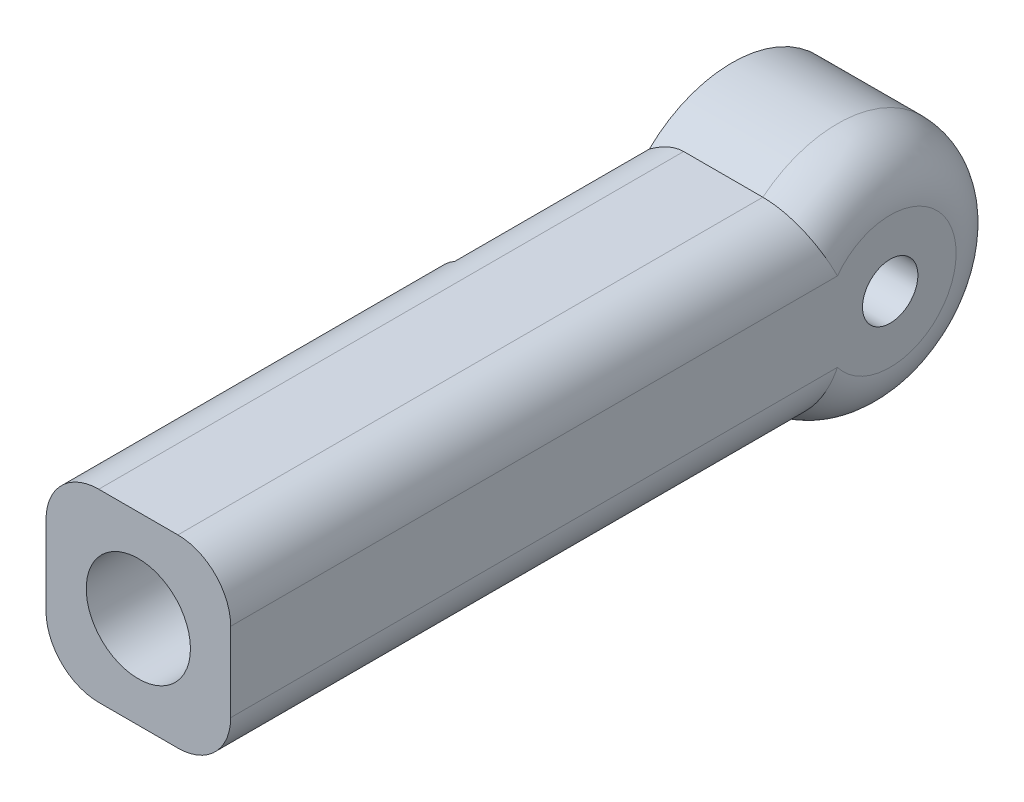
ISO-10303-21;
HEADER;
FILE_DESCRIPTION(('STEP AP214'),'2;1');
FILE_NAME('part.step','',(''),(''),'','','');
FILE_SCHEMA(('AUTOMOTIVE_DESIGN { 1 0 10303 214 1 1 1 1 }'));
ENDSEC;
DATA;
#1=APPLICATION_CONTEXT('core data for automotive mechanical design processes');
#2=APPLICATION_PROTOCOL_DEFINITION('international standard','automotive_design',2000,#1);
#3=PRODUCT_CONTEXT('',#1,'mechanical');
#4=PRODUCT('Part','Part','',(#3));
#5=PRODUCT_RELATED_PRODUCT_CATEGORY('part','',(#4));
#6=PRODUCT_DEFINITION_FORMATION('','',#4);
#7=PRODUCT_DEFINITION_CONTEXT('part definition',#1,'design');
#8=PRODUCT_DEFINITION('design','',#6,#7);
#9=PRODUCT_DEFINITION_SHAPE('','',#8);
#10=(LENGTH_UNIT() NAMED_UNIT(*) SI_UNIT(.MILLI.,.METRE.));
#11=(NAMED_UNIT(*) PLANE_ANGLE_UNIT() SI_UNIT($,.RADIAN.));
#12=(NAMED_UNIT(*) SI_UNIT($,.STERADIAN.) SOLID_ANGLE_UNIT());
#13=UNCERTAINTY_MEASURE_WITH_UNIT(LENGTH_MEASURE(1.E-05),#10,'distance_accuracy_value','');
#14=(GEOMETRIC_REPRESENTATION_CONTEXT(3) GLOBAL_UNCERTAINTY_ASSIGNED_CONTEXT((#13)) GLOBAL_UNIT_ASSIGNED_CONTEXT((#10,
#11,#12)) REPRESENTATION_CONTEXT('',''));
#15=CARTESIAN_POINT('',(0.,0.,0.));
#16=DIRECTION('',(0.,0.,1.));
#17=DIRECTION('',(1.,0.,0.));
#18=AXIS2_PLACEMENT_3D('',#15,#16,#17);
#19=CARTESIAN_POINT('',(7.,14.,0.));
#20=DIRECTION('',(0.,0.,-1.));
#21=DIRECTION('',(-1.,0.,0.));
#22=AXIS2_PLACEMENT_3D('',#19,#20,#21);
#23=PLANE('',#22);
#24=CARTESIAN_POINT('',(0.,7.,0.));
#25=DIRECTION('',(0.,0.,1.));
#26=DIRECTION('',(1.,0.,0.));
#27=AXIS2_PLACEMENT_3D('',#24,#25,#26);
#28=CIRCLE('',#27,3.95);
#29=CARTESIAN_POINT('',(3.95,7.,0.));
#30=VERTEX_POINT('',#29);
#31=EDGE_CURVE('E262',#30,#30,#28,.T.);
#32=ORIENTED_EDGE('',*,*,#31,.F.);
#33=EDGE_LOOP('',(#32));
#34=FACE_BOUND('',#33,.T.);
#35=DIRECTION('',(0.,-1.,0.));
#36=VECTOR('',#35,1.);
#37=CARTESIAN_POINT('',(-7.,14.,0.));
#38=LINE('',#37,#36);
#39=CARTESIAN_POINT('',(-7.,10.,0.));
#40=VERTEX_POINT('',#39);
#41=CARTESIAN_POINT('',(-7.,4.,0.));
#42=VERTEX_POINT('',#41);
#43=EDGE_CURVE('E279',#40,#42,#38,.T.);
#44=ORIENTED_EDGE('',*,*,#43,.T.);
#45=CARTESIAN_POINT('',(-3.,4.,0.));
#46=DIRECTION('',(0.,0.,-1.));
#47=DIRECTION('',(-1.,0.,0.));
#48=AXIS2_PLACEMENT_3D('',#45,#46,#47);
#49=CIRCLE('',#48,4.);
#50=CARTESIAN_POINT('',(-3.,0.,0.));
#51=VERTEX_POINT('',#50);
#52=EDGE_CURVE('E321',#42,#51,#49,.F.);
#53=ORIENTED_EDGE('',*,*,#52,.T.);
#54=DIRECTION('',(-1.,0.,0.));
#55=VECTOR('',#54,1.);
#56=CARTESIAN_POINT('',(7.,0.,0.));
#57=LINE('',#56,#55);
#58=CARTESIAN_POINT('',(3.,0.,0.));
#59=VERTEX_POINT('',#58);
#60=EDGE_CURVE('E153',#59,#51,#57,.T.);
#61=ORIENTED_EDGE('',*,*,#60,.F.);
#62=CARTESIAN_POINT('',(3.,4.,0.));
#63=DIRECTION('',(0.,0.,-1.));
#64=DIRECTION('',(-1.,0.,0.));
#65=AXIS2_PLACEMENT_3D('',#62,#63,#64);
#66=CIRCLE('',#65,4.);
#67=CARTESIAN_POINT('',(7.,4.,0.));
#68=VERTEX_POINT('',#67);
#69=EDGE_CURVE('E159',#59,#68,#66,.F.);
#70=ORIENTED_EDGE('',*,*,#69,.T.);
#71=DIRECTION('',(0.,-1.,0.));
#72=VECTOR('',#71,1.);
#73=CARTESIAN_POINT('',(7.,14.,0.));
#74=LINE('',#73,#72);
#75=CARTESIAN_POINT('',(7.,10.,0.));
#76=VERTEX_POINT('',#75);
#77=EDGE_CURVE('E280',#76,#68,#74,.T.);
#78=ORIENTED_EDGE('',*,*,#77,.F.);
#79=CARTESIAN_POINT('',(3.,10.,0.));
#80=DIRECTION('',(0.,0.,-1.));
#81=DIRECTION('',(-1.,0.,0.));
#82=AXIS2_PLACEMENT_3D('',#79,#80,#81);
#83=CIRCLE('',#82,4.);
#84=CARTESIAN_POINT('',(3.,14.,0.));
#85=VERTEX_POINT('',#84);
#86=EDGE_CURVE('E317',#76,#85,#83,.F.);
#87=ORIENTED_EDGE('',*,*,#86,.T.);
#88=DIRECTION('',(-1.,0.,0.));
#89=VECTOR('',#88,1.);
#90=CARTESIAN_POINT('',(7.,14.,0.));
#91=LINE('',#90,#89);
#92=CARTESIAN_POINT('',(-3.,14.,0.));
#93=VERTEX_POINT('',#92);
#94=EDGE_CURVE('E282',#85,#93,#91,.T.);
#95=ORIENTED_EDGE('',*,*,#94,.T.);
#96=CARTESIAN_POINT('',(-3.,10.,0.));
#97=DIRECTION('',(0.,0.,-1.));
#98=DIRECTION('',(-1.,0.,0.));
#99=AXIS2_PLACEMENT_3D('',#96,#97,#98);
#100=CIRCLE('',#99,4.);
#101=EDGE_CURVE('E315',#93,#40,#100,.F.);
#102=ORIENTED_EDGE('',*,*,#101,.T.);
#103=EDGE_LOOP('',(#44,#53,#61,#70,#78,#87,#95,#102));
#104=FACE_BOUND('',#103,.T.);
#105=ADVANCED_FACE('F43',(#34,#104),#23,.F.);
#106=CARTESIAN_POINT('',(7.,0.,0.));
#107=DIRECTION('',(0.,1.,0.));
#108=DIRECTION('',(0.,0.,1.));
#109=AXIS2_PLACEMENT_3D('',#106,#107,#108);
#110=PLANE('',#109);
#111=ORIENTED_EDGE('',*,*,#60,.T.);
#112=DIRECTION('',(0.,0.,-1.));
#113=VECTOR('',#112,1.);
#114=CARTESIAN_POINT('',(-3.,0.,-29.));
#115=LINE('',#114,#113);
#116=CARTESIAN_POINT('',(-3.,0.,-44.3431457505076));
#117=VERTEX_POINT('',#116);
#118=EDGE_CURVE('E152',#51,#117,#115,.T.);
#119=ORIENTED_EDGE('',*,*,#118,.T.);
#120=DIRECTION('',(-1.,0.,0.));
#121=VECTOR('',#120,1.);
#122=CARTESIAN_POINT('',(7.,0.,-44.3431457505076));
#123=LINE('',#122,#121);
#124=CARTESIAN_POINT('',(3.,0.,-44.3431457505076));
#125=VERTEX_POINT('',#124);
#126=EDGE_CURVE('E136',#125,#117,#123,.T.);
#127=ORIENTED_EDGE('',*,*,#126,.F.);
#128=DIRECTION('',(0.,0.,-1.));
#129=VECTOR('',#128,1.);
#130=CARTESIAN_POINT('',(3.,0.,0.));
#131=LINE('',#130,#129);
#132=EDGE_CURVE('E149',#125,#59,#131,.F.);
#133=ORIENTED_EDGE('',*,*,#132,.T.);
#134=EDGE_LOOP('',(#111,#119,#127,#133));
#135=FACE_BOUND('',#134,.T.);
#136=ADVANCED_FACE('F148',(#135),#110,.F.);
#137=CARTESIAN_POINT('',(7.,7.,-50.));
#138=DIRECTION('',(-1.,0.,0.));
#139=DIRECTION('',(0.,0.,1.));
#140=AXIS2_PLACEMENT_3D('',#137,#138,#139);
#141=CYLINDRICAL_SURFACE('',#140,9.00000000000002);
#142=DIRECTION('',(-1.,0.,0.));
#143=VECTOR('',#142,1.);
#144=CARTESIAN_POINT('',(7.,14.,-44.3431457505076));
#145=LINE('',#144,#143);
#146=CARTESIAN_POINT('',(3.,14.,-44.3431457505076));
#147=VERTEX_POINT('',#146);
#148=CARTESIAN_POINT('',(-3.,14.,-44.3431457505076));
#149=VERTEX_POINT('',#148);
#150=EDGE_CURVE('E138',#147,#149,#145,.T.);
#151=ORIENTED_EDGE('',*,*,#150,.F.);
#152=CARTESIAN_POINT('',(3.,7.,-50.));
#153=DIRECTION('',(-1.,0.,0.));
#154=DIRECTION('',(0.,0.,1.));
#155=AXIS2_PLACEMENT_3D('',#152,#153,#154);
#156=CIRCLE('',#155,9.00000000000002);
#157=EDGE_CURVE('E132',#147,#125,#156,.T.);
#158=ORIENTED_EDGE('',*,*,#157,.T.);
#159=ORIENTED_EDGE('',*,*,#126,.T.);
#160=CARTESIAN_POINT('',(-3.,0.,-44.3431457505076));
#161=CARTESIAN_POINT('',(-3.0901284291927,-3.10900983044397E-05,-44.3432081670165));
#162=CARTESIAN_POINT('',(-3.18021464623232,0.00304460141172136,-44.3393783953009));
#163=CARTESIAN_POINT('',(-3.35921091252534,0.0151623450559649,-44.3244201799329));
#164=CARTESIAN_POINT('',(-3.44812284641537,0.0241932277351229,-44.3133054001532));
#165=CARTESIAN_POINT('',(-3.62153879516282,0.0476399630353421,-44.2846697388711));
#166=CARTESIAN_POINT('',(-3.70609638029895,0.0618965199128939,-44.2673386560431));
#167=CARTESIAN_POINT('',(-3.87281833272948,0.0954618122043751,-44.2269552935628));
#168=CARTESIAN_POINT('',(-3.95498191695584,0.114772180532696,-44.2039011648869));
#169=CARTESIAN_POINT('',(-4.12191132008441,0.15952095567433,-44.1511438922696));
#170=CARTESIAN_POINT('',(-4.2064806665022,0.185284091748121,-44.1210979150121));
#171=CARTESIAN_POINT('',(-4.3721516785743,0.241694369062263,-44.0563352607812));
#172=CARTESIAN_POINT('',(-4.45325181838612,0.272343631890024,-44.0216165559045));
#173=CARTESIAN_POINT('',(-4.61437301449219,0.339173044990269,-43.9472356883128));
#174=CARTESIAN_POINT('',(-4.69427619551781,0.375498968329301,-43.9074507576797));
#175=CARTESIAN_POINT('',(-4.85009321690804,0.452510684425348,-43.8247592931414));
#176=CARTESIAN_POINT('',(-4.92601311787173,0.493189549483541,-43.7818577532586));
#177=CARTESIAN_POINT('',(-5.00000000000007,0.535898384862283,-43.7377807201301));
#178=B_SPLINE_CURVE_WITH_KNOTS('',3,(#160,#161,#162,#163,#164,#165,#166,#167,#168,#169,#170,
#171,#172,#173,#174,#175,#176,#177),.UNSPECIFIED.,.F.,.F.,(4,2,2,2,2,2,2,2,4),(0.,
0.270184743472431,0.539864168918652,0.8019268370722,1.06407428388199,1.3438475101966,
1.62374254836745,1.91260752585141,2.20101942669657),.UNSPECIFIED.);
#179=CARTESIAN_POINT('',(-5.,0.535898384862242,-43.7377807201299));
#180=VERTEX_POINT('',#179);
#181=EDGE_CURVE('E166',#117,#180,#178,.T.);
#182=ORIENTED_EDGE('',*,*,#181,.T.);
#183=CARTESIAN_POINT('',(-5.,7.,-50.));
#184=DIRECTION('',(1.,0.,0.));
#185=DIRECTION('',(0.,0.,-1.));
#186=AXIS2_PLACEMENT_3D('',#183,#184,#185);
#187=CIRCLE('',#186,9.00000000000002);
#188=CARTESIAN_POINT('',(-5.,13.4641016151378,-43.7377807201299));
#189=VERTEX_POINT('',#188);
#190=EDGE_CURVE('E277',#180,#189,#187,.T.);
#191=ORIENTED_EDGE('',*,*,#190,.T.);
#192=CARTESIAN_POINT('',(-5.,13.4641016151378,-43.7377807201299));
#193=CARTESIAN_POINT('',(-4.93136378289156,13.5037184926368,-43.7786710702639));
#194=CARTESIAN_POINT('',(-4.861108362858,13.5415703322536,-43.8185244025753));
#195=CARTESIAN_POINT('',(-4.71717522574085,13.6135597599549,-43.8956076082422));
#196=CARTESIAN_POINT('',(-4.64349252655541,13.6476916834722,-43.9328334509899));
#197=CARTESIAN_POINT('',(-4.41577847957703,13.7447261234888,-44.0403006139496));
#198=CARTESIAN_POINT('',(-4.25650449966885,13.8014325477732,-44.1054551293744));
#199=CARTESIAN_POINT('',(-3.94986848943148,13.8883392177844,-44.2073622252666));
#200=CARTESIAN_POINT('',(-3.80422168073524,13.9212173613601,-44.2468884090995));
#201=CARTESIAN_POINT('',(-3.58132136361631,13.9582477174521,-44.2918349801754));
#202=CARTESIAN_POINT('',(-3.50647298031619,13.9685329933297,-44.3044132077532));
#203=CARTESIAN_POINT('',(-3.35565799594275,13.984876979659,-44.3244676686124));
#204=CARTESIAN_POINT('',(-3.27969216820086,13.990938484522,-44.3319472750272));
#205=CARTESIAN_POINT('',(-3.16964195508287,13.9965450216348,-44.3388726154486));
#206=CARTESIAN_POINT('',(-3.13576302595186,13.9978393422736,-44.3404729149912));
#207=CARTESIAN_POINT('',(-3.06792443331737,13.9995672010202,-44.3426100973169));
#208=CARTESIAN_POINT('',(-3.0339647284307,14.0000000959922,-44.3431461855647));
#209=CARTESIAN_POINT('',(-3.,14.,-44.3431457505076));
#210=B_SPLINE_CURVE_WITH_KNOTS('',3,(#192,#193,#194,#195,#196,#197,#198,#199,#200,#201,#202,
#203,#204,#205,#206,#207,#208,#209),.UNSPECIFIED.,.F.,.F.,(4,2,2,2,2,2,2,2,4),(0.,
0.267447769348498,0.53529727091456,1.07655795339851,1.53787430176634,1.76740267841787,
1.99677905648468,2.09858035880348,2.20045763696002),.UNSPECIFIED.);
#211=EDGE_CURVE('E163',#189,#149,#210,.T.);
#212=ORIENTED_EDGE('',*,*,#211,.T.);
#213=EDGE_LOOP('',(#151,#158,#159,#182,#191,#212));
#214=FACE_BOUND('',#213,.T.);
#215=ADVANCED_FACE('F134',(#214),#141,.T.);
#216=CARTESIAN_POINT('',(7.,14.,0.));
#217=DIRECTION('',(0.,-1.,0.));
#218=DIRECTION('',(0.,0.,-1.));
#219=AXIS2_PLACEMENT_3D('',#216,#217,#218);
#220=PLANE('',#219);
#221=ORIENTED_EDGE('',*,*,#94,.F.);
#222=DIRECTION('',(0.,0.,1.));
#223=VECTOR('',#222,1.);
#224=CARTESIAN_POINT('',(3.,14.,0.));
#225=LINE('',#224,#223);
#226=EDGE_CURVE('E218',#85,#147,#225,.F.);
#227=ORIENTED_EDGE('',*,*,#226,.T.);
#228=ORIENTED_EDGE('',*,*,#150,.T.);
#229=DIRECTION('',(0.,0.,1.));
#230=VECTOR('',#229,1.);
#231=CARTESIAN_POINT('',(-3.,14.,0.));
#232=LINE('',#231,#230);
#233=EDGE_CURVE('E327',#149,#93,#232,.T.);
#234=ORIENTED_EDGE('',*,*,#233,.T.);
#235=EDGE_LOOP('',(#221,#227,#228,#234));
#236=FACE_BOUND('',#235,.T.);
#237=ADVANCED_FACE('F223',(#236),#220,.F.);
#238=CARTESIAN_POINT('',(7.,7.,-50.));
#239=DIRECTION('',(-1.,0.,0.));
#240=DIRECTION('',(0.,0.,1.));
#241=AXIS2_PLACEMENT_3D('',#238,#239,#240);
#242=PLANE('',#241);
#243=CARTESIAN_POINT('',(7.,7.,-50.));
#244=DIRECTION('',(1.,0.,0.));
#245=DIRECTION('',(0.,0.,-1.));
#246=AXIS2_PLACEMENT_3D('',#243,#244,#245);
#247=CIRCLE('',#246,2.1);
#248=CARTESIAN_POINT('',(7.,7.,-52.1));
#249=VERTEX_POINT('',#248);
#250=EDGE_CURVE('E258',#249,#249,#247,.T.);
#251=ORIENTED_EDGE('',*,*,#250,.F.);
#252=EDGE_LOOP('',(#251));
#253=FACE_BOUND('',#252,.T.);
#254=CARTESIAN_POINT('',(7.,7.,-50.));
#255=DIRECTION('',(-1.,0.,0.));
#256=DIRECTION('',(0.,0.,1.));
#257=AXIS2_PLACEMENT_3D('',#254,#255,#256);
#258=CIRCLE('',#257,5.00000000000002);
#259=CARTESIAN_POINT('',(7.,4.,-46.));
#260=VERTEX_POINT('',#259);
#261=CARTESIAN_POINT('',(7.,10.,-46.));
#262=VERTEX_POINT('',#261);
#263=EDGE_CURVE('E142',#260,#262,#258,.F.);
#264=ORIENTED_EDGE('',*,*,#263,.T.);
#265=DIRECTION('',(0.,0.,1.));
#266=VECTOR('',#265,1.);
#267=CARTESIAN_POINT('',(7.,10.,-50.));
#268=LINE('',#267,#266);
#269=EDGE_CURVE('E60',#262,#76,#268,.T.);
#270=ORIENTED_EDGE('',*,*,#269,.T.);
#271=ORIENTED_EDGE('',*,*,#77,.T.);
#272=DIRECTION('',(0.,0.,-1.));
#273=VECTOR('',#272,1.);
#274=CARTESIAN_POINT('',(7.,4.,-50.));
#275=LINE('',#274,#273);
#276=EDGE_CURVE('E68',#68,#260,#275,.T.);
#277=ORIENTED_EDGE('',*,*,#276,.T.);
#278=EDGE_LOOP('',(#264,#270,#271,#277));
#279=FACE_BOUND('',#278,.T.);
#280=ADVANCED_FACE('F227',(#253,#279),#242,.F.);
#281=CARTESIAN_POINT('',(-7.,7.,-50.));
#282=DIRECTION('',(-1.,0.,0.));
#283=DIRECTION('',(0.,0.,1.));
#284=AXIS2_PLACEMENT_3D('',#281,#282,#283);
#285=PLANE('',#284);
#286=DIRECTION('',(0.,1.,0.));
#287=VECTOR('',#286,1.);
#288=CARTESIAN_POINT('',(-7.,7.,-29.));
#289=LINE('',#288,#287);
#290=CARTESIAN_POINT('',(-7.,4.,-29.));
#291=VERTEX_POINT('',#290);
#292=CARTESIAN_POINT('',(-7.,10.,-29.));
#293=VERTEX_POINT('',#292);
#294=EDGE_CURVE('E161',#291,#293,#289,.T.);
#295=ORIENTED_EDGE('',*,*,#294,.F.);
#296=DIRECTION('',(0.,0.,-1.));
#297=VECTOR('',#296,1.);
#298=CARTESIAN_POINT('',(-7.,4.,0.));
#299=LINE('',#298,#297);
#300=EDGE_CURVE('E312',#291,#42,#299,.F.);
#301=ORIENTED_EDGE('',*,*,#300,.T.);
#302=ORIENTED_EDGE('',*,*,#43,.F.);
#303=DIRECTION('',(0.,0.,1.));
#304=VECTOR('',#303,1.);
#305=CARTESIAN_POINT('',(-7.,10.,-29.));
#306=LINE('',#305,#304);
#307=EDGE_CURVE('E310',#40,#293,#306,.F.);
#308=ORIENTED_EDGE('',*,*,#307,.T.);
#309=EDGE_LOOP('',(#295,#301,#302,#308));
#310=FACE_BOUND('',#309,.T.);
#311=ADVANCED_FACE('F229',(#310),#285,.T.);
#312=CARTESIAN_POINT('',(-5.,0.,0.));
#313=DIRECTION('',(1.,0.,0.));
#314=DIRECTION('',(0.,0.,-1.));
#315=AXIS2_PLACEMENT_3D('',#312,#313,#314);
#316=PLANE('',#315);
#317=CARTESIAN_POINT('',(-5.,7.,-50.));
#318=DIRECTION('',(1.,0.,0.));
#319=DIRECTION('',(0.,0.,-1.));
#320=AXIS2_PLACEMENT_3D('',#317,#318,#319);
#321=CIRCLE('',#320,2.1);
#322=CARTESIAN_POINT('',(-5.,7.,-52.1));
#323=VERTEX_POINT('',#322);
#324=EDGE_CURVE('E48',#323,#323,#321,.T.);
#325=ORIENTED_EDGE('',*,*,#324,.T.);
#326=EDGE_LOOP('',(#325));
#327=FACE_BOUND('',#326,.T.);
#328=ORIENTED_EDGE('',*,*,#190,.F.);
#329=DIRECTION('',(0.,0.,1.));
#330=VECTOR('',#329,1.);
#331=CARTESIAN_POINT('',(-5.,0.535898384862242,-43.7377807201299));
#332=LINE('',#331,#330);
#333=CARTESIAN_POINT('',(-5.,0.535898384862244,-29.));
#334=VERTEX_POINT('',#333);
#335=EDGE_CURVE('E301',#180,#334,#332,.T.);
#336=ORIENTED_EDGE('',*,*,#335,.T.);
#337=DIRECTION('',(0.,1.,0.));
#338=VECTOR('',#337,1.);
#339=CARTESIAN_POINT('',(-5.,16.,-29.));
#340=LINE('',#339,#338);
#341=CARTESIAN_POINT('',(-5.,13.4641016151378,-29.));
#342=VERTEX_POINT('',#341);
#343=EDGE_CURVE('E272',#334,#342,#340,.T.);
#344=ORIENTED_EDGE('',*,*,#343,.T.);
#345=DIRECTION('',(0.,0.,-1.));
#346=VECTOR('',#345,1.);
#347=CARTESIAN_POINT('',(-5.,13.4641016151378,-29.));
#348=LINE('',#347,#346);
#349=EDGE_CURVE('E297',#342,#189,#348,.T.);
#350=ORIENTED_EDGE('',*,*,#349,.T.);
#351=EDGE_LOOP('',(#328,#336,#344,#350));
#352=FACE_BOUND('',#351,.T.);
#353=ADVANCED_FACE('F232',(#327,#352),#316,.F.);
#354=CARTESIAN_POINT('',(-5.,16.,-29.));
#355=DIRECTION('',(0.,0.,1.));
#356=DIRECTION('',(0.,-1.,0.));
#357=AXIS2_PLACEMENT_3D('',#354,#355,#356);
#358=PLANE('',#357);
#359=ORIENTED_EDGE('',*,*,#343,.F.);
#360=CARTESIAN_POINT('',(-3.,4.,-29.));
#361=DIRECTION('',(0.,0.,1.));
#362=DIRECTION('',(0.,-1.,0.));
#363=AXIS2_PLACEMENT_3D('',#360,#361,#362);
#364=CIRCLE('',#363,4.);
#365=EDGE_CURVE('E307',#334,#291,#364,.F.);
#366=ORIENTED_EDGE('',*,*,#365,.T.);
#367=ORIENTED_EDGE('',*,*,#294,.T.);
#368=CARTESIAN_POINT('',(-3.,10.,-29.));
#369=DIRECTION('',(0.,0.,1.));
#370=DIRECTION('',(0.,-1.,0.));
#371=AXIS2_PLACEMENT_3D('',#368,#369,#370);
#372=CIRCLE('',#371,4.);
#373=EDGE_CURVE('E304',#293,#342,#372,.F.);
#374=ORIENTED_EDGE('',*,*,#373,.T.);
#375=EDGE_LOOP('',(#359,#366,#367,#374));
#376=FACE_BOUND('',#375,.T.);
#377=ADVANCED_FACE('F211',(#376),#358,.F.);
#378=CARTESIAN_POINT('',(-3.,4.,0.));
#379=DIRECTION('',(0.,0.,1.));
#380=DIRECTION('',(1.,0.,0.));
#381=AXIS2_PLACEMENT_3D('',#378,#379,#380);
#382=CYLINDRICAL_SURFACE('',#381,4.);
#383=ORIENTED_EDGE('',*,*,#52,.F.);
#384=ORIENTED_EDGE('',*,*,#300,.F.);
#385=ORIENTED_EDGE('',*,*,#365,.F.);
#386=ORIENTED_EDGE('',*,*,#335,.F.);
#387=ORIENTED_EDGE('',*,*,#181,.F.);
#388=ORIENTED_EDGE('',*,*,#118,.F.);
#389=EDGE_LOOP('',(#383,#384,#385,#386,#387,#388));
#390=FACE_BOUND('',#389,.T.);
#391=ADVANCED_FACE('F208',(#390),#382,.T.);
#392=CARTESIAN_POINT('',(3.,4.,-50.));
#393=DIRECTION('',(0.,0.,-1.));
#394=DIRECTION('',(-1.,0.,0.));
#395=AXIS2_PLACEMENT_3D('',#392,#393,#394);
#396=CYLINDRICAL_SURFACE('',#395,4.);
#397=ORIENTED_EDGE('',*,*,#69,.F.);
#398=ORIENTED_EDGE('',*,*,#132,.F.);
#399=CARTESIAN_POINT('',(3.,0.,-44.3431457505076));
#400=CARTESIAN_POINT('',(3.10751962179763,-1.49215218706123E-05,-44.3431431254536));
#401=CARTESIAN_POINT('',(3.21503552862488,0.00433455757148518,-44.3446783344329));
#402=CARTESIAN_POINT('',(3.42926868854748,0.0216531471730514,-44.3508049412871));
#403=CARTESIAN_POINT('',(3.53598605076583,0.0346210573664043,-44.3553959135769));
#404=CARTESIAN_POINT('',(3.74764821233431,0.0690327564429515,-44.3676022907986));
#405=CARTESIAN_POINT('',(3.85259614498433,0.0904594462785363,-44.3752115944551));
#406=CARTESIAN_POINT('',(4.06019204846108,0.141578058509817,-44.3934171640968));
#407=CARTESIAN_POINT('',(4.16284000825026,0.171270020561299,-44.4040134444132));
#408=CARTESIAN_POINT('',(4.36511040723876,0.238639947098809,-44.4281434218956));
#409=CARTESIAN_POINT('',(4.46473338656783,0.27631647618779,-44.4416765911034));
#410=CARTESIAN_POINT('',(4.66031244963052,0.35930381224713,-44.4716179608331));
#411=CARTESIAN_POINT('',(4.75626716482445,0.404617434980295,-44.4880272218468));
#412=CARTESIAN_POINT('',(5.03761205546826,0.551410102625541,-44.54146211757));
#413=CARTESIAN_POINT('',(5.21666920719063,0.663803532996041,-44.5827170240371));
#414=CARTESIAN_POINT('',(5.55642908039809,0.916106689746898,-44.6766722455214));
#415=CARTESIAN_POINT('',(5.71669770306909,1.05651761427948,-44.7295831924652));
#416=CARTESIAN_POINT('',(6.01133933019567,1.35871813439565,-44.8455372394211));
#417=CARTESIAN_POINT('',(6.14570600716928,1.52051293753088,-44.9085828082988));
#418=CARTESIAN_POINT('',(6.39234473655305,1.86927980928968,-45.0474304250772));
#419=CARTESIAN_POINT('',(6.50310237234614,2.05712410395665,-45.123725707119));
#420=CARTESIAN_POINT('',(6.69169100759899,2.4450268105184,-45.2855082815953));
#421=CARTESIAN_POINT('',(6.76950913721503,2.64508996159144,-45.370999150521));
#422=CARTESIAN_POINT('',(6.886953930569,3.03567757682385,-45.54308277343));
#423=CARTESIAN_POINT('',(6.9290857739423,3.22572913152353,-45.6290696252805));
#424=CARTESIAN_POINT('',(6.98527232888631,3.60682231901764,-45.8070767755886));
#425=CARTESIAN_POINT('',(6.99937980969974,3.79786141061301,-45.8990853969367));
#426=CARTESIAN_POINT('',(6.99999335316293,3.99156670489216,-45.9957850138948));
#427=CARTESIAN_POINT('',(7.00000002029012,3.99578374909386,-45.9978918692305));
#428=CARTESIAN_POINT('',(7.,4.,-46.));
#429=B_SPLINE_CURVE_WITH_KNOTS('',3,(#399,#400,#401,#402,#403,#404,#405,#406,#407,#408,#409,
#410,#411,#412,#413,#414,#415,#416,#417,#418,#419,#420,#421,#422,#423,#424,#425,#426,#427,#428),
.UNSPECIFIED.,.F.,.F.,(4,2,2,2,2,2,2,2,2,2,2,2,2,2,4),(0.,0.322454285859181,0.6448636719473,
0.966624631825865,1.28838713550155,1.61009184446476,1.93191542505686,2.57497672102547,
3.23078284902627,3.88674897880974,4.57686477867722,5.26724996639153,5.90379330317733,
6.53913690276216,6.5532790532468),.UNSPECIFIED.);
#430=EDGE_CURVE('E11',#125,#260,#429,.T.);
#431=ORIENTED_EDGE('',*,*,#430,.T.);
#432=ORIENTED_EDGE('',*,*,#276,.F.);
#433=EDGE_LOOP('',(#397,#398,#431,#432));
#434=FACE_BOUND('',#433,.T.);
#435=ADVANCED_FACE('F157',(#434),#396,.T.);
#436=CARTESIAN_POINT('',(3.,10.,-50.));
#437=DIRECTION('',(0.,0.,1.));
#438=DIRECTION('',(1.,0.,0.));
#439=AXIS2_PLACEMENT_3D('',#436,#437,#438);
#440=CYLINDRICAL_SURFACE('',#439,4.);
#441=ORIENTED_EDGE('',*,*,#269,.F.);
#442=CARTESIAN_POINT('',(3.,14.,-44.3431457505076));
#443=CARTESIAN_POINT('',(3.10751962179763,14.0000149215219,-44.3431431254537));
#444=CARTESIAN_POINT('',(3.21503552862488,13.9956654424285,-44.3446783344329));
#445=CARTESIAN_POINT('',(3.42926868854748,13.978346852827,-44.3508049412871));
#446=CARTESIAN_POINT('',(3.53598605076583,13.9653789426336,-44.3553959135768));
#447=CARTESIAN_POINT('',(3.74764821233431,13.9309672435571,-44.3676022907986));
#448=CARTESIAN_POINT('',(3.85259614498433,13.9095405537215,-44.3752115944551));
#449=CARTESIAN_POINT('',(4.06019204846108,13.8584219414902,-44.3934171640968));
#450=CARTESIAN_POINT('',(4.16284000825026,13.8287299794387,-44.4040134444132));
#451=CARTESIAN_POINT('',(4.36511040723876,13.7613600529012,-44.4281434218956));
#452=CARTESIAN_POINT('',(4.46473338656783,13.7236835238122,-44.4416765911034));
#453=CARTESIAN_POINT('',(4.66031244963052,13.6406961877529,-44.4716179608331));
#454=CARTESIAN_POINT('',(4.75626716482445,13.5953825650197,-44.4880272218468));
#455=CARTESIAN_POINT('',(5.03761205546826,13.4485898973745,-44.54146211757));
#456=CARTESIAN_POINT('',(5.21666920719063,13.336196467004,-44.5827170240372));
#457=CARTESIAN_POINT('',(5.55642908039809,13.0838933102531,-44.6766722455214));
#458=CARTESIAN_POINT('',(5.71669770306908,12.9434823857205,-44.7295831924652));
#459=CARTESIAN_POINT('',(6.01133933019567,12.6412818656044,-44.8455372394211));
#460=CARTESIAN_POINT('',(6.14570600716928,12.4794870624691,-44.9085828082988));
#461=CARTESIAN_POINT('',(6.39234473655305,12.1307201907103,-45.0474304250772));
#462=CARTESIAN_POINT('',(6.50310237234614,11.9428758960434,-45.123725707119));
#463=CARTESIAN_POINT('',(6.69169100759899,11.5549731894816,-45.2855082815953));
#464=CARTESIAN_POINT('',(6.76950913721503,11.3549100384086,-45.370999150521));
#465=CARTESIAN_POINT('',(6.886953930569,10.9643224231762,-45.54308277343));
#466=CARTESIAN_POINT('',(6.9290857739423,10.7742708684765,-45.6290696252805));
#467=CARTESIAN_POINT('',(6.98527232888631,10.3931776809824,-45.8070767755886));
#468=CARTESIAN_POINT('',(6.99937980969974,10.2021385893871,-45.8990853969369));
#469=CARTESIAN_POINT('',(6.99999335316293,10.0084332951078,-45.9957850138949));
#470=CARTESIAN_POINT('',(7.00000002029012,10.0042162509061,-45.9978918692305));
#471=CARTESIAN_POINT('',(7.,10.,-46.));
#472=B_SPLINE_CURVE_WITH_KNOTS('',3,(#442,#443,#444,#445,#446,#447,#448,#449,#450,#451,#452,
#453,#454,#455,#456,#457,#458,#459,#460,#461,#462,#463,#464,#465,#466,#467,#468,#469,#470,#471),
.UNSPECIFIED.,.F.,.F.,(4,2,2,2,2,2,2,2,2,2,2,2,2,2,4),(0.,0.322454285859181,0.644863671947299,
0.966624631825865,1.28838713550155,1.61009184446476,1.93191542505686,2.57497672102547,
3.23078284902627,3.88674897880974,4.57686477867723,5.26724996639152,5.90379330317733,
6.53913690276216,6.5532790532468),.UNSPECIFIED.);
#473=EDGE_CURVE('E53',#262,#147,#472,.F.);
#474=ORIENTED_EDGE('',*,*,#473,.T.);
#475=ORIENTED_EDGE('',*,*,#226,.F.);
#476=ORIENTED_EDGE('',*,*,#86,.F.);
#477=EDGE_LOOP('',(#441,#474,#475,#476));
#478=FACE_BOUND('',#477,.T.);
#479=ADVANCED_FACE('F185',(#478),#440,.T.);
#480=CARTESIAN_POINT('',(-3.,10.,0.));
#481=DIRECTION('',(0.,0.,-1.));
#482=DIRECTION('',(-1.,0.,0.));
#483=AXIS2_PLACEMENT_3D('',#480,#481,#482);
#484=CYLINDRICAL_SURFACE('',#483,4.);
#485=ORIENTED_EDGE('',*,*,#373,.F.);
#486=ORIENTED_EDGE('',*,*,#307,.F.);
#487=ORIENTED_EDGE('',*,*,#101,.F.);
#488=ORIENTED_EDGE('',*,*,#233,.F.);
#489=ORIENTED_EDGE('',*,*,#211,.F.);
#490=ORIENTED_EDGE('',*,*,#349,.F.);
#491=EDGE_LOOP('',(#485,#486,#487,#488,#489,#490));
#492=FACE_BOUND('',#491,.T.);
#493=ADVANCED_FACE('F188',(#492),#484,.T.);
#494=CARTESIAN_POINT('',(3.,7.,-50.));
#495=DIRECTION('',(-1.,0.,0.));
#496=DIRECTION('',(0.,0.,1.));
#497=AXIS2_PLACEMENT_3D('',#494,#495,#496);
#498=TOROIDAL_SURFACE('',#497,5.00000000000002,4.);
#499=ORIENTED_EDGE('',*,*,#430,.F.);
#500=ORIENTED_EDGE('',*,*,#157,.F.);
#501=ORIENTED_EDGE('',*,*,#473,.F.);
#502=ORIENTED_EDGE('',*,*,#263,.F.);
#503=EDGE_LOOP('',(#499,#500,#501,#502));
#504=FACE_BOUND('',#503,.T.);
#505=ADVANCED_FACE('F45',(#504),#498,.T.);
#506=CARTESIAN_POINT('',(0.,7.,-25.));
#507=DIRECTION('',(0.,0.,1.));
#508=DIRECTION('',(1.,0.,0.));
#509=AXIS2_PLACEMENT_3D('',#506,#507,#508);
#510=CYLINDRICAL_SURFACE('',#509,3.95);
#511=CARTESIAN_POINT('',(0.,7.,-25.));
#512=DIRECTION('',(0.,0.,1.));
#513=DIRECTION('',(1.,0.,0.));
#514=AXIS2_PLACEMENT_3D('',#511,#512,#513);
#515=CIRCLE('',#514,3.95);
#516=CARTESIAN_POINT('',(3.95,7.,-25.));
#517=VERTEX_POINT('',#516);
#518=EDGE_CURVE('E266',#517,#517,#515,.T.);
#519=ORIENTED_EDGE('',*,*,#518,.F.);
#520=EDGE_LOOP('',(#519));
#521=FACE_BOUND('',#520,.T.);
#522=ORIENTED_EDGE('',*,*,#31,.T.);
#523=EDGE_LOOP('',(#522));
#524=FACE_BOUND('',#523,.T.);
#525=ADVANCED_FACE('F197',(#521,#524),#510,.F.);
#526=CARTESIAN_POINT('',(0.,7.,-25.));
#527=DIRECTION('',(0.,0.,1.));
#528=DIRECTION('',(1.,0.,0.));
#529=AXIS2_PLACEMENT_3D('',#526,#527,#528);
#530=PLANE('',#529);
#531=ORIENTED_EDGE('',*,*,#518,.T.);
#532=EDGE_LOOP('',(#531));
#533=FACE_BOUND('',#532,.T.);
#534=ADVANCED_FACE('F245',(#533),#530,.T.);
#535=CARTESIAN_POINT('',(7.,7.,-50.));
#536=DIRECTION('',(1.,0.,0.));
#537=DIRECTION('',(0.,0.,-1.));
#538=AXIS2_PLACEMENT_3D('',#535,#536,#537);
#539=CYLINDRICAL_SURFACE('',#538,2.1);
#540=ORIENTED_EDGE('',*,*,#250,.T.);
#541=EDGE_LOOP('',(#540));
#542=FACE_BOUND('',#541,.T.);
#543=ORIENTED_EDGE('',*,*,#324,.F.);
#544=EDGE_LOOP('',(#543));
#545=FACE_BOUND('',#544,.T.);
#546=ADVANCED_FACE('F249',(#542,#545),#539,.F.);
#547=CLOSED_SHELL('',(#105,#136,#215,#237,#280,#311,#353,#377,#391,#435,#479,#493,#505,#525,
#534,#546));
#548=MANIFOLD_SOLID_BREP('B2',#547);
#549=ADVANCED_BREP_SHAPE_REPRESENTATION('',(#18,#548),#14);
#550=SHAPE_DEFINITION_REPRESENTATION(#9,#549);
ENDSEC;
END-ISO-10303-21;
